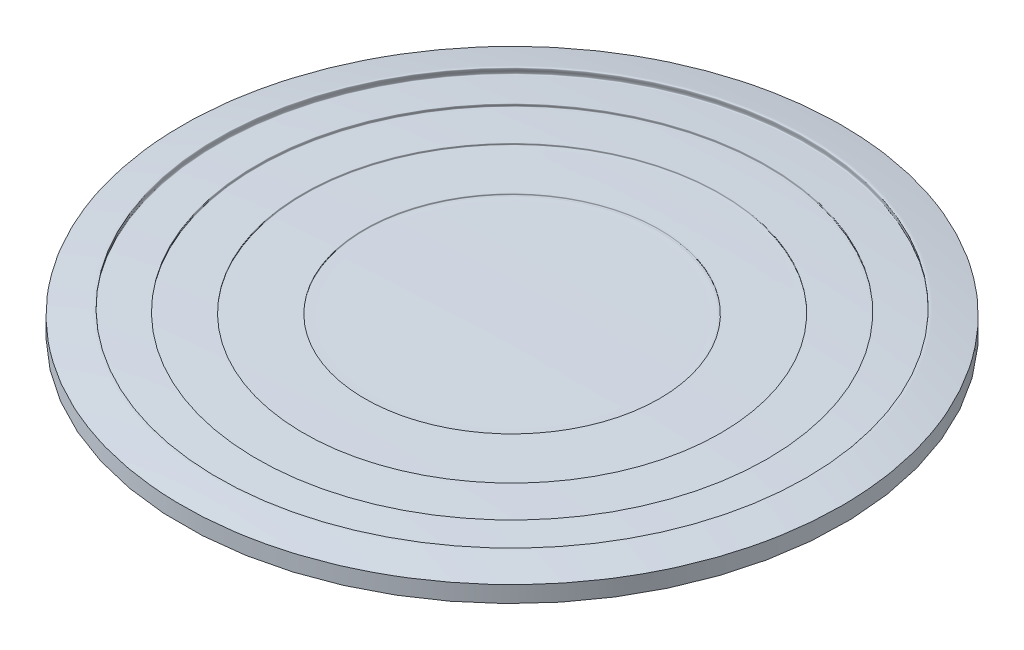
ISO-10303-21;
HEADER;
FILE_DESCRIPTION(('STEP AP214'),'2;1');
FILE_NAME('part.step','',(''),(''),'','','');
FILE_SCHEMA(('AUTOMOTIVE_DESIGN { 1 0 10303 214 1 1 1 1 }'));
ENDSEC;
DATA;
#1=APPLICATION_CONTEXT('core data for automotive mechanical design processes');
#2=APPLICATION_PROTOCOL_DEFINITION('international standard','automotive_design',2000,#1);
#3=PRODUCT_CONTEXT('',#1,'mechanical');
#4=PRODUCT('Part','Part','',(#3));
#5=PRODUCT_RELATED_PRODUCT_CATEGORY('part','',(#4));
#6=PRODUCT_DEFINITION_FORMATION('','',#4);
#7=PRODUCT_DEFINITION_CONTEXT('part definition',#1,'design');
#8=PRODUCT_DEFINITION('design','',#6,#7);
#9=PRODUCT_DEFINITION_SHAPE('','',#8);
#10=(LENGTH_UNIT() NAMED_UNIT(*) SI_UNIT(.MILLI.,.METRE.));
#11=(NAMED_UNIT(*) PLANE_ANGLE_UNIT() SI_UNIT($,.RADIAN.));
#12=(NAMED_UNIT(*) SI_UNIT($,.STERADIAN.) SOLID_ANGLE_UNIT());
#13=UNCERTAINTY_MEASURE_WITH_UNIT(LENGTH_MEASURE(1.E-05),#10,'distance_accuracy_value','');
#14=(GEOMETRIC_REPRESENTATION_CONTEXT(3) GLOBAL_UNCERTAINTY_ASSIGNED_CONTEXT((#13)) GLOBAL_UNIT_ASSIGNED_CONTEXT((#10,
#11,#12)) REPRESENTATION_CONTEXT('',''));
#15=CARTESIAN_POINT('',(0.,0.,0.));
#16=DIRECTION('',(0.,0.,1.));
#17=DIRECTION('',(1.,0.,0.));
#18=AXIS2_PLACEMENT_3D('',#15,#16,#17);
#19=CARTESIAN_POINT('',(0.,0.,0.));
#20=DIRECTION('',(0.,-1.,0.));
#21=DIRECTION('',(0.,0.,-1.));
#22=AXIS2_PLACEMENT_3D('',#19,#20,#21);
#23=PLANE('',#22);
#24=CARTESIAN_POINT('',(0.,0.,0.));
#25=DIRECTION('',(0.,-1.,0.));
#26=DIRECTION('',(0.,0.,-1.));
#27=AXIS2_PLACEMENT_3D('',#24,#25,#26);
#28=CIRCLE('',#27,20.);
#29=CARTESIAN_POINT('',(0.,0.,-20.));
#30=VERTEX_POINT('',#29);
#31=EDGE_CURVE('E11',#30,#30,#28,.T.);
#32=ORIENTED_EDGE('',*,*,#31,.T.);
#33=EDGE_LOOP('',(#32));
#34=FACE_BOUND('',#33,.T.);
#35=ADVANCED_FACE('F39',(#34),#23,.T.);
#36=CARTESIAN_POINT('',(0.,0.,0.));
#37=DIRECTION('',(0.,-1.,0.));
#38=DIRECTION('',(0.,0.,-1.));
#39=AXIS2_PLACEMENT_3D('',#36,#37,#38);
#40=CYLINDRICAL_SURFACE('',#39,20.);
#41=CARTESIAN_POINT('',(0.,1.,0.));
#42=DIRECTION('',(0.,-1.,0.));
#43=DIRECTION('',(0.,0.,-1.));
#44=AXIS2_PLACEMENT_3D('',#41,#42,#43);
#45=CIRCLE('',#44,20.);
#46=CARTESIAN_POINT('',(0.,1.,-20.));
#47=VERTEX_POINT('',#46);
#48=EDGE_CURVE('E45',#47,#47,#45,.T.);
#49=ORIENTED_EDGE('',*,*,#48,.T.);
#50=EDGE_LOOP('',(#49));
#51=FACE_BOUND('',#50,.T.);
#52=ORIENTED_EDGE('',*,*,#31,.F.);
#53=EDGE_LOOP('',(#52));
#54=FACE_BOUND('',#53,.T.);
#55=ADVANCED_FACE('F51',(#51,#54),#40,.T.);
#56=CARTESIAN_POINT('',(20.,1.,0.));
#57=CARTESIAN_POINT('',(19.9929060685285,1.00146746479464,0.));
#58=CARTESIAN_POINT('',(19.9787181964689,1.00440239626982,0.));
#59=CARTESIAN_POINT('',(19.886491838838,1.02345356462054,0.));
#60=CARTESIAN_POINT('',(19.7232785453248,1.05695035902497,0.));
#61=CARTESIAN_POINT('',(19.4747860094845,1.1073130036566,0.));
#62=CARTESIAN_POINT('',(19.2545752109023,1.15133640225185,0.));
#63=CARTESIAN_POINT('',(18.9987368096287,1.20190734980057,0.));
#64=CARTESIAN_POINT('',(18.7854304817937,1.2435057182521,0.));
#65=CARTESIAN_POINT('',(18.5435661258788,1.29003137958682,0.));
#66=CARTESIAN_POINT('',(18.3656541473991,1.32390151381956,0.));
#67=CARTESIAN_POINT('',(18.1948028102058,1.35606048238329,0.));
#68=CARTESIAN_POINT('',(18.0808579302966,1.37735592193733,0.));
#69=CARTESIAN_POINT('',(18.009647081919,1.39057254374284,0.));
#70=CARTESIAN_POINT('',(17.9740214901492,1.39718616825045,0.));
#71=CARTESIAN_POINT('',(17.9526772514913,1.40111169241087,0.));
#72=CARTESIAN_POINT('',(17.9312130264095,1.4051719772532,0.));
#73=CARTESIAN_POINT('',(17.9101925867936,1.40870920537507,0.));
#74=CARTESIAN_POINT('',(17.7514105522527,1.44697786811449,0.));
#75=CARTESIAN_POINT('',(18.0275876667482,0.976953022105912,0.));
#76=CARTESIAN_POINT('',(17.8640026546585,1.00259122587018,0.));
#77=CARTESIAN_POINT('',(17.8402451437696,1.0042933414538,0.));
#78=CARTESIAN_POINT('',(17.8159316339202,1.00662007117472,0.));
#79=CARTESIAN_POINT('',(17.7917667819525,1.00877574840005,0.));
#80=CARTESIAN_POINT('',(17.7675620242772,1.01097366500732,0.));
#81=CARTESIAN_POINT('',(17.7433676101225,1.01315632831454,0.));
#82=CARTESIAN_POINT('',(17.7030380593949,1.0167947655554,0.));
#83=CARTESIAN_POINT('',(17.2513501477686,1.05741529823279,0.));
#84=CARTESIAN_POINT('',(16.7349711974157,1.10210986781301,0.));
#85=CARTESIAN_POINT('',(16.1538746024558,1.15018314230813,0.));
#86=CARTESIAN_POINT('',(15.9359335046065,1.16795562220982,0.));
#87=CARTESIAN_POINT('',(15.7583499878781,1.18222143484128,0.));
#88=CARTESIAN_POINT('',(15.6614658113454,1.18995547295645,0.));
#89=CARTESIAN_POINT('',(15.6130357279669,1.19379240417461,0.));
#90=CARTESIAN_POINT('',(15.5888008727722,1.19572924131852,0.));
#91=CARTESIAN_POINT('',(15.5646394872271,1.19758417416918,0.));
#92=CARTESIAN_POINT('',(15.540203543256,1.19973039662541,0.));
#93=CARTESIAN_POINT('',(15.5167903829044,1.2007756365569,0.));
#94=CARTESIAN_POINT('',(15.4226504392211,1.21854445353677,0.));
#95=CARTESIAN_POINT('',(15.5617939303646,0.984488623595472,0.));
#96=CARTESIAN_POINT('',(15.4623433222104,1.00243982297348,0.));
#97=CARTESIAN_POINT('',(15.4347522503621,1.00275209761553,0.));
#98=CARTESIAN_POINT('',(15.405743786131,1.0045673740924,0.));
#99=CARTESIAN_POINT('',(15.377115032792,1.00597658209904,0.));
#100=CARTESIAN_POINT('',(15.3483841938491,1.00749089242511,0.));
#101=CARTESIAN_POINT('',(15.3101126394173,1.00946774938173,0.));
#102=CARTESIAN_POINT('',(15.2718299567094,1.01145034287276,0.));
#103=CARTESIAN_POINT('',(15.0995705073471,1.02033342480693,0.));
#104=CARTESIAN_POINT('',(14.5157820621121,1.04997802572719,0.));
#105=CARTESIAN_POINT('',(13.8840435624159,1.08022705179015,0.));
#106=CARTESIAN_POINT('',(13.3001084504361,1.10671905007517,0.));
#107=CARTESIAN_POINT('',(13.0990651718921,1.11569528425574,0.));
#108=CARTESIAN_POINT('',(12.9267541162574,1.12324365484732,0.));
#109=CARTESIAN_POINT('',(12.8405795505212,1.12700347150546,0.));
#110=CARTESIAN_POINT('',(12.7927240864341,1.12906282706496,0.));
#111=CARTESIAN_POINT('',(12.7639742488105,1.13033307992526,0.));
#112=CARTESIAN_POINT('',(12.7353592852421,1.13146012227064,0.));
#113=CARTESIAN_POINT('',(12.7062406349167,1.13310833366656,0.));
#114=CARTESIAN_POINT('',(12.6790008961557,1.1327991735394,0.));
#115=CARTESIAN_POINT('',(12.6024562416409,1.14840259682882,0.));
#116=CARTESIAN_POINT('',(12.6967628634062,0.983349766179128,0.));
#117=CARTESIAN_POINT('',(12.6097745111073,1.00318580818409,0.));
#118=CARTESIAN_POINT('',(12.5747894428609,1.00185981475203,0.));
#119=CARTESIAN_POINT('',(12.5367199825133,1.00372573017787,0.));
#120=CARTESIAN_POINT('',(12.499476962881,1.0047317243095,0.));
#121=CARTESIAN_POINT('',(12.4620118349038,1.00596378250243,0.));
#122=CARTESIAN_POINT('',(12.4246060371027,1.00713059916191,0.));
#123=CARTESIAN_POINT('',(12.3871843468614,1.00831054771395,0.));
#124=CARTESIAN_POINT('',(12.3372946180719,1.00987301076879,0.));
#125=CARTESIAN_POINT('',(11.663760483363,1.03089095436242,0.));
#126=CARTESIAN_POINT('',(10.9028604661238,1.05270971024009,0.));
#127=CARTESIAN_POINT('',(10.0545736501087,1.07467763599714,0.));
#128=CARTESIAN_POINT('',(9.7427031143242,1.08249410691106,0.));
#129=CARTESIAN_POINT('',(9.45576347657452,1.08946895349486,0.));
#130=CARTESIAN_POINT('',(9.26864425585858,1.09387401088661,0.));
#131=CARTESIAN_POINT('',(9.16883052466305,1.0962068203733,0.));
#132=CARTESIAN_POINT('',(9.13141699312063,1.09706110247949,0.));
#133=CARTESIAN_POINT('',(9.09394108454135,1.09797537011535,0.));
#134=CARTESIAN_POINT('',(9.05669761195105,1.09864861391005,0.));
#135=CARTESIAN_POINT('',(9.01858624668819,1.10020498077628,0.));
#136=CARTESIAN_POINT('',(8.98371354219666,1.09844826480636,0.));
#137=CARTESIAN_POINT('',(8.9100271250847,1.11506678894618,0.));
#138=CARTESIAN_POINT('',(8.98482450723902,0.962328418677509,0.));
#139=CARTESIAN_POINT('',(8.84453612542021,1.01121580598584,0.));
#140=CARTESIAN_POINT('',(8.76611733690011,1.00067678091296,0.));
#141=CARTESIAN_POINT('',(8.67258690117506,1.00552907337078,0.));
#142=CARTESIAN_POINT('',(8.58310526623548,1.00623612456635,0.));
#143=CARTESIAN_POINT('',(8.49253839274297,1.00803322894464,0.));
#144=CARTESIAN_POINT('',(8.40226192162469,1.00951696039855,0.));
#145=CARTESIAN_POINT('',(8.3119072947568,1.01106392988691,0.));
#146=CARTESIAN_POINT('',(8.19146192324313,1.01307591301388,0.));
#147=CARTESIAN_POINT('',(8.04089495190523,1.01555923752454,0.));
#148=CARTESIAN_POINT('',(7.16761381242085,1.02962992719572,0.));
#149=CARTESIAN_POINT('',(5.48121196759226,1.05263899780567,0.));
#150=CARTESIAN_POINT('',(3.52367124303971,1.06965242587233,0.));
#151=CARTESIAN_POINT('',(1.98772077624779,1.07739458465645,0.));
#152=CARTESIAN_POINT('',(1.14444699496419,1.07993226885797,0.));
#153=CARTESIAN_POINT('',(0.481872681856494,1.08091563307933,0.));
#154=CARTESIAN_POINT('',(0.150585214351552,1.08105236638098,0.));
#155=CARTESIAN_POINT('',(0.,1.0810604,0.));
#156=B_SPLINE_CURVE_WITH_KNOTS('',3,(#56,#57,#58,#59,#60,#61,#62,#63,#64,#65,#66,#67,#68,#69,
#70,#71,#72,#73,#74,#75,#76,#77,#78,#79,#80,#81,#82,#83,#84,#85,#86,#87,#88,#89,#90,#91,#92,#93,
#94,#95,#96,#97,#98,#99,#100,#101,#102,#103,#104,#105,#106,#107,#108,#109,#110,#111,#112,#113,
#114,#115,#116,#117,#118,#119,#120,#121,#122,#123,#124,#125,#126,#127,#128,#129,#130,#131,#132,
#133,#134,#135,#136,#137,#138,#139,#140,#141,#142,#143,#144,#145,#146,#147,#148,#149,#150,#151,
#152,#153,#154,#155),.UNSPECIFIED.,.F.,.F.,(4,1,1,1,1,1,1,1,1,1,1,1,1,1,1,1,1,1,1,1,1,1,1,1,1,1,
1,1,1,1,1,1,1,1,1,1,1,1,1,1,1,1,1,1,1,1,1,1,1,1,1,1,1,1,1,1,1,1,1,1,1,1,1,1,1,1,1,1,1,1,1,1,1,1,
1,1,1,1,1,1,1,1,1,1,1,1,1,1,1,1,1,1,1,1,1,1,1,4),(0.,0.00103949148535831,0.00207898430660503,
0.0135133751367836,0.0249478270274055,0.0384612215967581,0.045737634446066,0.0623695204848618,
0.0696459581919949,0.0810803612408499,0.0883568114290089,0.0945937569796337,0.0977122611309383,
0.0987517275011913,0.0997912461248871,0.100830724728545,0.101870209525082,0.102909699697858,
0.122662754564665,0.123824860158554,0.124986905131074,0.126149032406776,0.127311099095709,
0.128473153282294,0.129635242190296,0.130797318200222,0.134283564724182,0.194711824633447,
0.205170599791843,0.217953488040425,0.226088043074616,0.230736368905813,0.231898493613346,
0.233060559289903,0.234222613634504,0.235384704724409,0.236546784517453,0.237708900339317,
0.247436207885871,0.24881123405797,0.25018630100212,0.251561360965237,0.252936414208962,
0.254311460249036,0.25568654736211,0.258436652799293,0.259811719163731,0.280437567506638,
0.34231517386105,0.350565548814122,0.364316124747694,0.371191430200327,0.375316581914466,
0.376691637005778,0.378066686104071,0.379441777216382,0.380816814986967,0.382191894797539,
0.383566920881511,0.390035832806721,0.391826507967208,0.393617177627109,0.395407794147786,
0.397198453007791,0.39898910656758,0.400779802499756,0.402570445355709,0.40436108280895,
0.40794238982888,0.499265847878128,0.513591057831825,0.529706979198632,0.54403222243886,
0.554776158538312,0.556566813363466,0.558357469082458,0.560148125600545,0.561938778262361,
0.563729436537837,0.565520090879753,0.567310746195159,0.572158759072516,0.576480386052725,
0.580802017917157,0.585123645331467,0.589445273138592,0.593766901649958,0.598088530762363,
0.602410160866481,0.606731787162011,0.615375043336774,0.624018300605473,0.732059022131283,
0.857386251927116,0.904924170426926,0.952462084516867,0.978391856316115,1.),.UNSPECIFIED.);
#157=CARTESIAN_POINT('',(0.,0.,0.));
#158=DIRECTION('',(0.,-1.,0.));
#159=AXIS1_PLACEMENT('',#157,#158);
#160=SURFACE_OF_REVOLUTION('',#156,#159);
#161=CARTESIAN_POINT('',(0.,1.0810604,0.));
#162=VERTEX_POINT('',#161);
#163=VERTEX_LOOP('',#162);
#164=FACE_BOUND('',#163,.T.);
#165=ORIENTED_EDGE('',*,*,#48,.F.);
#166=EDGE_LOOP('',(#165));
#167=FACE_BOUND('',#166,.T.);
#168=ADVANCED_FACE('F48',(#164,#167),#160,.F.);
#169=CLOSED_SHELL('',(#35,#55,#168));
#170=MANIFOLD_SOLID_BREP('B2',#169);
#171=ADVANCED_BREP_SHAPE_REPRESENTATION('',(#18,#170),#14);
#172=SHAPE_DEFINITION_REPRESENTATION(#9,#171);
ENDSEC;
END-ISO-10303-21;
